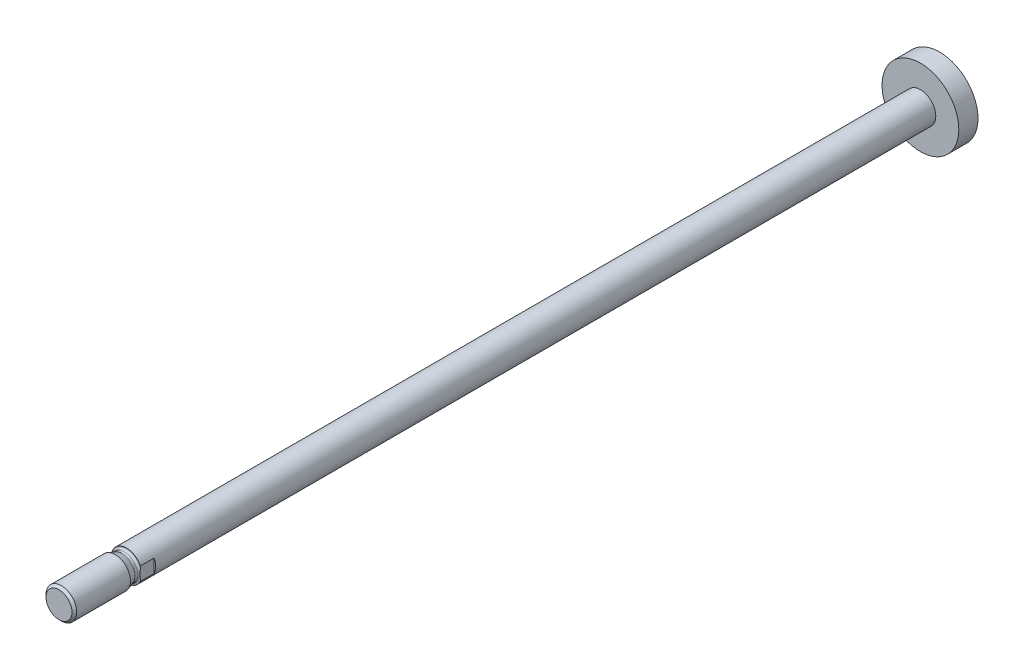
ISO-10303-21;
HEADER;
FILE_DESCRIPTION(('STEP AP214'),'2;1');
FILE_NAME('part.step','',(''),(''),'','','');
FILE_SCHEMA(('AUTOMOTIVE_DESIGN { 1 0 10303 214 1 1 1 1 }'));
ENDSEC;
DATA;
#1=APPLICATION_CONTEXT('core data for automotive mechanical design processes');
#2=APPLICATION_PROTOCOL_DEFINITION('international standard','automotive_design',2000,#1);
#3=PRODUCT_CONTEXT('',#1,'mechanical');
#4=PRODUCT('Part','Part','',(#3));
#5=PRODUCT_RELATED_PRODUCT_CATEGORY('part','',(#4));
#6=PRODUCT_DEFINITION_FORMATION('','',#4);
#7=PRODUCT_DEFINITION_CONTEXT('part definition',#1,'design');
#8=PRODUCT_DEFINITION('design','',#6,#7);
#9=PRODUCT_DEFINITION_SHAPE('','',#8);
#10=(LENGTH_UNIT() NAMED_UNIT(*) SI_UNIT(.MILLI.,.METRE.));
#11=(NAMED_UNIT(*) PLANE_ANGLE_UNIT() SI_UNIT($,.RADIAN.));
#12=(NAMED_UNIT(*) SI_UNIT($,.STERADIAN.) SOLID_ANGLE_UNIT());
#13=UNCERTAINTY_MEASURE_WITH_UNIT(LENGTH_MEASURE(1.E-05),#10,'distance_accuracy_value','');
#14=(GEOMETRIC_REPRESENTATION_CONTEXT(3) GLOBAL_UNCERTAINTY_ASSIGNED_CONTEXT((#13)) GLOBAL_UNIT_ASSIGNED_CONTEXT((#10,
#11,#12)) REPRESENTATION_CONTEXT('',''));
#15=CARTESIAN_POINT('',(0.,0.,0.));
#16=DIRECTION('',(0.,0.,1.));
#17=DIRECTION('',(1.,0.,0.));
#18=AXIS2_PLACEMENT_3D('',#15,#16,#17);
#19=CARTESIAN_POINT('',(0.,0.,28.));
#20=DIRECTION('',(0.,0.,-1.));
#21=DIRECTION('',(-1.,0.,0.));
#22=AXIS2_PLACEMENT_3D('',#19,#20,#21);
#23=PLANE('',#22);
#24=CARTESIAN_POINT('',(0.,0.,28.00000000002));
#25=DIRECTION('',(0.,0.,-1.));
#26=DIRECTION('',(-1.,0.,0.));
#27=AXIS2_PLACEMENT_3D('',#24,#25,#26);
#28=CIRCLE('',#27,4.23299999994242);
#29=CARTESIAN_POINT('',(-4.23299999994242,0.,28.00000000002));
#30=VERTEX_POINT('',#29);
#31=EDGE_CURVE('E19',#30,#30,#28,.T.);
#32=ORIENTED_EDGE('',*,*,#31,.F.);
#33=EDGE_LOOP('',(#32));
#34=FACE_BOUND('',#33,.T.);
#35=ADVANCED_FACE('F16',(#34),#23,.F.);
#36=CARTESIAN_POINT('',(0.,0.,27.2330000000807));
#37=DIRECTION('',(0.,0.,-1.));
#38=DIRECTION('',(-1.,0.,0.));
#39=AXIS2_PLACEMENT_3D('',#36,#37,#38);
#40=CONICAL_SURFACE('',#39,4.99999999988177,0.785398163397448);
#41=ORIENTED_EDGE('',*,*,#31,.T.);
#42=EDGE_LOOP('',(#41));
#43=FACE_BOUND('',#42,.T.);
#44=CARTESIAN_POINT('',(0.,0.,27.233));
#45=DIRECTION('',(0.,0.,1.));
#46=DIRECTION('',(1.,0.,0.));
#47=AXIS2_PLACEMENT_3D('',#44,#45,#46);
#48=CIRCLE('',#47,5.);
#49=CARTESIAN_POINT('',(5.,0.,27.233));
#50=VERTEX_POINT('',#49);
#51=EDGE_CURVE('E254',#50,#50,#48,.F.);
#52=ORIENTED_EDGE('',*,*,#51,.F.);
#53=EDGE_LOOP('',(#52));
#54=FACE_BOUND('',#53,.T.);
#55=ADVANCED_FACE('F241',(#43,#54),#40,.T.);
#56=CARTESIAN_POINT('',(0.,0.,5.));
#57=DIRECTION('',(0.,0.,1.));
#58=DIRECTION('',(1.,0.,0.));
#59=AXIS2_PLACEMENT_3D('',#56,#57,#58);
#60=CYLINDRICAL_SURFACE('',#59,5.);
#61=ORIENTED_EDGE('',*,*,#51,.T.);
#62=EDGE_LOOP('',(#61));
#63=FACE_BOUND('',#62,.T.);
#64=CARTESIAN_POINT('',(0.,0.,9.69798193557381));
#65=DIRECTION('',(0.,0.,1.));
#66=DIRECTION('',(1.,0.,0.));
#67=AXIS2_PLACEMENT_3D('',#64,#65,#66);
#68=CIRCLE('',#67,4.99999999999545);
#69=CARTESIAN_POINT('',(4.99999999999545,0.,9.69798193557381));
#70=VERTEX_POINT('',#69);
#71=EDGE_CURVE('E255',#70,#70,#68,.F.);
#72=ORIENTED_EDGE('',*,*,#71,.F.);
#73=EDGE_LOOP('',(#72));
#74=FACE_BOUND('',#73,.T.);
#75=ADVANCED_FACE('F238',(#63,#74),#60,.T.);
#76=CARTESIAN_POINT('',(0.,0.,9.69798193557381));
#77=DIRECTION('',(0.,0.,1.));
#78=DIRECTION('',(1.,0.,0.));
#79=AXIS2_PLACEMENT_3D('',#76,#77,#78);
#80=CONICAL_SURFACE('',#79,4.99999999999545,0.349065850396762);
#81=ORIENTED_EDGE('',*,*,#71,.T.);
#82=EDGE_LOOP('',(#81));
#83=FACE_BOUND('',#82,.T.);
#84=CARTESIAN_POINT('',(0.,0.,7.59941589757032));
#85=DIRECTION('',(0.,0.,-1.));
#86=DIRECTION('',(-1.,0.,0.));
#87=AXIS2_PLACEMENT_3D('',#84,#85,#86);
#88=CIRCLE('',#87,4.23618442752846);
#89=CARTESIAN_POINT('',(-4.23618442752846,0.,7.59941589757032));
#90=VERTEX_POINT('',#89);
#91=EDGE_CURVE('E221',#90,#90,#88,.F.);
#92=ORIENTED_EDGE('',*,*,#91,.T.);
#93=EDGE_LOOP('',(#92));
#94=FACE_BOUND('',#93,.T.);
#95=ADVANCED_FACE('F233',(#83,#94),#80,.T.);
#96=CARTESIAN_POINT('',(0.,0.,7.39420381157492));
#97=DIRECTION('',(0.,0.,-1.));
#98=DIRECTION('',(-1.,0.,0.));
#99=AXIS2_PLACEMENT_3D('',#96,#97,#98);
#100=TOROIDAL_SURFACE('',#99,4.8,0.599999999999999);
#101=ORIENTED_EDGE('',*,*,#91,.F.);
#102=EDGE_LOOP('',(#101));
#103=FACE_BOUND('',#102,.T.);
#104=CARTESIAN_POINT('',(0.,0.,7.39420381157492));
#105=DIRECTION('',(0.,0.,1.));
#106=DIRECTION('',(1.,0.,0.));
#107=AXIS2_PLACEMENT_3D('',#104,#105,#106);
#108=CIRCLE('',#107,4.2);
#109=CARTESIAN_POINT('',(4.2,0.,7.39420381157492));
#110=VERTEX_POINT('',#109);
#111=EDGE_CURVE('E212',#110,#110,#108,.F.);
#112=ORIENTED_EDGE('',*,*,#111,.F.);
#113=EDGE_LOOP('',(#112));
#114=FACE_BOUND('',#113,.T.);
#115=ADVANCED_FACE('F228',(#103,#114),#100,.F.);
#116=CARTESIAN_POINT('',(0.,12.5,-258.85));
#117=DIRECTION('',(0.,0.,1.));
#118=DIRECTION('',(1.,0.,0.));
#119=AXIS2_PLACEMENT_3D('',#116,#117,#118);
#120=PLANE('',#119);
#121=CARTESIAN_POINT('',(0.,0.,-258.85));
#122=DIRECTION('',(0.,0.,1.));
#123=DIRECTION('',(1.,0.,0.));
#124=AXIS2_PLACEMENT_3D('',#121,#122,#123);
#125=CIRCLE('',#124,12.5);
#126=CARTESIAN_POINT('',(12.5,0.,-258.85));
#127=VERTEX_POINT('',#126);
#128=EDGE_CURVE('E220',#127,#127,#125,.T.);
#129=ORIENTED_EDGE('',*,*,#128,.F.);
#130=EDGE_LOOP('',(#129));
#131=FACE_BOUND('',#130,.T.);
#132=ADVANCED_FACE('F232',(#131),#120,.F.);
#133=CARTESIAN_POINT('',(0.,0.,5.));
#134=DIRECTION('',(0.,0.,1.));
#135=DIRECTION('',(1.,0.,0.));
#136=AXIS2_PLACEMENT_3D('',#133,#134,#135);
#137=CYLINDRICAL_SURFACE('',#136,4.2);
#138=ORIENTED_EDGE('',*,*,#111,.T.);
#139=EDGE_LOOP('',(#138));
#140=FACE_BOUND('',#139,.T.);
#141=CARTESIAN_POINT('',(0.,0.,6.6));
#142=DIRECTION('',(0.,0.,-1.));
#143=DIRECTION('',(-1.,0.,0.));
#144=AXIS2_PLACEMENT_3D('',#141,#142,#143);
#145=CIRCLE('',#144,4.2);
#146=CARTESIAN_POINT('',(-4.2,0.,6.6));
#147=VERTEX_POINT('',#146);
#148=EDGE_CURVE('E276',#147,#147,#145,.F.);
#149=ORIENTED_EDGE('',*,*,#148,.T.);
#150=EDGE_LOOP('',(#149));
#151=FACE_BOUND('',#150,.T.);
#152=ADVANCED_FACE('F271',(#140,#151),#137,.T.);
#153=CARTESIAN_POINT('',(0.,0.,-258.85));
#154=DIRECTION('',(0.,0.,1.));
#155=DIRECTION('',(1.,0.,0.));
#156=AXIS2_PLACEMENT_3D('',#153,#154,#155);
#157=CYLINDRICAL_SURFACE('',#156,12.5);
#158=CARTESIAN_POINT('',(0.,0.,-252.6));
#159=DIRECTION('',(0.,0.,1.));
#160=DIRECTION('',(1.,0.,0.));
#161=AXIS2_PLACEMENT_3D('',#158,#159,#160);
#162=CIRCLE('',#161,12.5);
#163=CARTESIAN_POINT('',(12.5,0.,-252.6));
#164=VERTEX_POINT('',#163);
#165=EDGE_CURVE('E204',#164,#164,#162,.F.);
#166=ORIENTED_EDGE('',*,*,#165,.T.);
#167=EDGE_LOOP('',(#166));
#168=FACE_BOUND('',#167,.T.);
#169=ORIENTED_EDGE('',*,*,#128,.T.);
#170=EDGE_LOOP('',(#169));
#171=FACE_BOUND('',#170,.T.);
#172=ADVANCED_FACE('F174',(#168,#171),#157,.T.);
#173=CARTESIAN_POINT('',(0.,0.,6.6));
#174=DIRECTION('',(0.,0.,-1.));
#175=DIRECTION('',(-1.,0.,0.));
#176=AXIS2_PLACEMENT_3D('',#173,#174,#175);
#177=TOROIDAL_SURFACE('',#176,4.8,0.599999999999998);
#178=ORIENTED_EDGE('',*,*,#148,.F.);
#179=EDGE_LOOP('',(#178));
#180=FACE_BOUND('',#179,.T.);
#181=CARTESIAN_POINT('',(-4.5,-1.670329308849,6.));
#182=CARTESIAN_POINT('',(-4.5,-1.6369330513631,6.00000117040223));
#183=CARTESIAN_POINT('',(-4.5,-1.60353870008505,6.00033761281317));
#184=CARTESIAN_POINT('',(-4.5,-1.53678402517574,6.00158286188886));
#185=CARTESIAN_POINT('',(-4.5,-1.50342369418502,6.00249126346591));
#186=CARTESIAN_POINT('',(-4.5,-1.43672915385537,6.00478221519337));
#187=CARTESIAN_POINT('',(-4.5,-1.403394939861,6.00616463519658));
#188=CARTESIAN_POINT('',(-4.5,-1.33675010316127,6.0093127773252));
#189=CARTESIAN_POINT('',(-4.5,-1.30343947758629,6.0110784396036));
#190=CARTESIAN_POINT('',(-4.5,-1.23682740984282,6.01490639659544));
#191=CARTESIAN_POINT('',(-4.5,-1.20352597189788,6.01696876357747));
#192=CARTESIAN_POINT('',(-4.5,-1.13692453490198,6.02130706454382));
#193=CARTESIAN_POINT('',(-4.5,-1.10362454110037,6.02358307854023));
#194=CARTESIAN_POINT('',(-4.5,-0.970055500660211,6.03297450091988));
#195=CARTESIAN_POINT('',(-4.5,-0.869824880093467,6.04061462109113));
#196=CARTESIAN_POINT('',(-4.5,-0.669294095444825,6.05497755898394));
#197=CARTESIAN_POINT('',(-4.5,-0.568993932116027,6.06170038648787));
#198=CARTESIAN_POINT('',(-4.5,-0.368332410875038,6.07244573968657));
#199=CARTESIAN_POINT('',(-4.5,-0.26797120652601,6.076470876583));
#200=CARTESIAN_POINT('',(-4.5,-0.0672525736976672,6.08072036023677));
#201=CARTESIAN_POINT('',(-4.5,0.0331047738284561,6.08094818941855));
#202=CARTESIAN_POINT('',(-4.5,0.233769564385185,6.07754740137777));
#203=CARTESIAN_POINT('',(-4.5,0.334076991677368,6.07391793974281));
#204=CARTESIAN_POINT('',(-4.5,0.534637397699597,6.06379928349027));
#205=CARTESIAN_POINT('',(-4.5,0.634890214053077,6.05730714852695));
#206=CARTESIAN_POINT('',(-4.5,0.835373518086889,6.04317942656312));
#207=CARTESIAN_POINT('',(-4.5,0.935603947060965,6.03554308551951));
#208=CARTESIAN_POINT('',(-4.5,1.13611388640718,6.02119700715942));
#209=CARTESIAN_POINT('',(-4.5,1.23639337665127,6.01448702408238));
#210=CARTESIAN_POINT('',(-4.5,1.39231556393481,6.00654495544654));
#211=CARTESIAN_POINT('',(-4.5,1.44789697514886,6.00420470218304));
#212=CARTESIAN_POINT('',(-4.5,1.55909116687587,6.00093588356944));
#213=CARTESIAN_POINT('',(-4.5,1.61470394147135,6.00000710765029));
#214=CARTESIAN_POINT('',(-4.5,1.67032930884898,6.));
#215=B_SPLINE_CURVE_WITH_KNOTS('',3,(#181,#182,#183,#184,#185,#186,#187,#188,#189,#190,#191,
#192,#193,#194,#195,#196,#197,#198,#199,#200,#201,#202,#203,#204,#205,#206,#207,#208,#209,#210,
#211,#212,#213,#214),.UNSPECIFIED.,.F.,.F.,(4,2,2,2,2,2,2,2,2,2,2,2,2,2,2,2,4),(0.,
0.100184360814044,0.200297846163573,0.300383866187946,0.400454268039522,0.500549085512339,
0.600681539794873,0.902246113316891,1.20380747058151,1.50507651146084,1.80606925014599,
2.10712789373254,2.4084964874746,2.71006456677907,3.01155248641771,3.17842827063363,
3.34527915730057),.UNSPECIFIED.);
#216=CARTESIAN_POINT('',(-4.5,-1.670329308849,6.));
#217=VERTEX_POINT('',#216);
#218=CARTESIAN_POINT('',(-4.5,1.67032930884898,5.99999999999986));
#219=VERTEX_POINT('',#218);
#220=EDGE_CURVE('E99',#217,#219,#215,.T.);
#221=ORIENTED_EDGE('',*,*,#220,.F.);
#222=CARTESIAN_POINT('',(0.,0.,6.));
#223=DIRECTION('',(0.,0.,1.));
#224=DIRECTION('',(-0.9375,-0.347985272676876,0.));
#225=AXIS2_PLACEMENT_3D('',#222,#223,#224);
#226=CIRCLE('',#225,4.79999999999999);
#227=CARTESIAN_POINT('',(4.5,-1.67032930884898,5.99999999999993));
#228=VERTEX_POINT('',#227);
#229=EDGE_CURVE('E144',#217,#228,#226,.T.);
#230=ORIENTED_EDGE('',*,*,#229,.T.);
#231=CARTESIAN_POINT('',(4.5,1.670329308849,6.));
#232=CARTESIAN_POINT('',(4.5,1.6369330513631,6.00000117040223));
#233=CARTESIAN_POINT('',(4.5,1.60353870008505,6.00033761281317));
#234=CARTESIAN_POINT('',(4.5,1.53678402517574,6.00158286188886));
#235=CARTESIAN_POINT('',(4.5,1.50342369418502,6.00249126346591));
#236=CARTESIAN_POINT('',(4.5,1.43672915385538,6.00478221519337));
#237=CARTESIAN_POINT('',(4.5,1.403394939861,6.00616463519658));
#238=CARTESIAN_POINT('',(4.5,1.33675010316128,6.0093127773252));
#239=CARTESIAN_POINT('',(4.5,1.30343947758629,6.0110784396036));
#240=CARTESIAN_POINT('',(4.5,1.23682740984282,6.01490639659544));
#241=CARTESIAN_POINT('',(4.5,1.20352597189788,6.01696876357747));
#242=CARTESIAN_POINT('',(4.5,1.13692453490198,6.02130706454382));
#243=CARTESIAN_POINT('',(4.5,1.10362454110037,6.02358307854023));
#244=CARTESIAN_POINT('',(4.5,0.970055500660213,6.03297450091988));
#245=CARTESIAN_POINT('',(4.5,0.869824880093468,6.04061462109113));
#246=CARTESIAN_POINT('',(4.5,0.669294095444826,6.05497755898394));
#247=CARTESIAN_POINT('',(4.5,0.568993932116028,6.06170038648787));
#248=CARTESIAN_POINT('',(4.5,0.368332410875039,6.07244573968657));
#249=CARTESIAN_POINT('',(4.5,0.267971206526011,6.076470876583));
#250=CARTESIAN_POINT('',(4.5,0.0672525736976679,6.08072036023677));
#251=CARTESIAN_POINT('',(4.5,-0.0331047738284553,6.08094818941855));
#252=CARTESIAN_POINT('',(4.5,-0.233769564385184,6.07754740137777));
#253=CARTESIAN_POINT('',(4.5,-0.334076991677367,6.07391793974281));
#254=CARTESIAN_POINT('',(4.5,-0.534637397699596,6.06379928349027));
#255=CARTESIAN_POINT('',(4.5,-0.634890214053076,6.05730714852695));
#256=CARTESIAN_POINT('',(4.5,-0.835373518086889,6.04317942656312));
#257=CARTESIAN_POINT('',(4.5,-0.935603947060965,6.03554308551951));
#258=CARTESIAN_POINT('',(4.5,-1.13611388640718,6.02119700715942));
#259=CARTESIAN_POINT('',(4.5,-1.23639337665127,6.01448702408238));
#260=CARTESIAN_POINT('',(4.5,-1.39231556393481,6.00654495544654));
#261=CARTESIAN_POINT('',(4.5,-1.44789697514886,6.00420470218304));
#262=CARTESIAN_POINT('',(4.5,-1.55909116687587,6.00093588356944));
#263=CARTESIAN_POINT('',(4.5,-1.61470394147135,6.00000710765029));
#264=CARTESIAN_POINT('',(4.5,-1.67032930884898,6.));
#265=B_SPLINE_CURVE_WITH_KNOTS('',3,(#231,#232,#233,#234,#235,#236,#237,#238,#239,#240,#241,
#242,#243,#244,#245,#246,#247,#248,#249,#250,#251,#252,#253,#254,#255,#256,#257,#258,#259,#260,
#261,#262,#263,#264),.UNSPECIFIED.,.F.,.F.,(4,2,2,2,2,2,2,2,2,2,2,2,2,2,2,2,4),(0.,
0.100184360814044,0.200297846163573,0.300383866187946,0.400454268039522,0.500549085512339,
0.600681539794873,0.902246113316891,1.20380747058151,1.50507651146084,1.80606925014599,
2.10712789373254,2.4084964874746,2.71006456677907,3.01155248641771,3.17842827063363,
3.34527915730057),.UNSPECIFIED.);
#266=CARTESIAN_POINT('',(4.5,1.670329308849,6.));
#267=VERTEX_POINT('',#266);
#268=EDGE_CURVE('E75',#267,#228,#265,.T.);
#269=ORIENTED_EDGE('',*,*,#268,.F.);
#270=CARTESIAN_POINT('',(0.,0.,6.));
#271=DIRECTION('',(0.,0.,1.));
#272=DIRECTION('',(0.9375,0.347985272676875,0.));
#273=AXIS2_PLACEMENT_3D('',#270,#271,#272);
#274=CIRCLE('',#273,4.79999999999999);
#275=EDGE_CURVE('E70',#267,#219,#274,.T.);
#276=ORIENTED_EDGE('',*,*,#275,.T.);
#277=EDGE_LOOP('',(#221,#230,#269,#276));
#278=FACE_BOUND('',#277,.T.);
#279=ADVANCED_FACE('F111',(#180,#278),#177,.F.);
#280=CARTESIAN_POINT('',(0.,5.,-252.6));
#281=DIRECTION('',(0.,0.,-1.));
#282=DIRECTION('',(-1.,0.,0.));
#283=AXIS2_PLACEMENT_3D('',#280,#281,#282);
#284=PLANE('',#283);
#285=CARTESIAN_POINT('',(0.,0.,-252.6));
#286=DIRECTION('',(0.,0.,1.));
#287=DIRECTION('',(1.,0.,0.));
#288=AXIS2_PLACEMENT_3D('',#285,#286,#287);
#289=CIRCLE('',#288,5.);
#290=CARTESIAN_POINT('',(5.,0.,-252.6));
#291=VERTEX_POINT('',#290);
#292=EDGE_CURVE('E92',#291,#291,#289,.T.);
#293=ORIENTED_EDGE('',*,*,#292,.F.);
#294=EDGE_LOOP('',(#293));
#295=FACE_BOUND('',#294,.T.);
#296=ORIENTED_EDGE('',*,*,#165,.F.);
#297=EDGE_LOOP('',(#296));
#298=FACE_BOUND('',#297,.T.);
#299=ADVANCED_FACE('F167',(#295,#298),#284,.F.);
#300=CARTESIAN_POINT('',(0.,0.,6.));
#301=DIRECTION('',(0.,0.,-1.));
#302=DIRECTION('',(-1.,0.,0.));
#303=AXIS2_PLACEMENT_3D('',#300,#301,#302);
#304=PLANE('',#303);
#305=CARTESIAN_POINT('',(0.,0.,6.00000000000001));
#306=DIRECTION('',(0.,0.,1.));
#307=DIRECTION('',(1.,0.,0.));
#308=AXIS2_PLACEMENT_3D('',#305,#306,#307);
#309=CIRCLE('',#308,5.);
#310=CARTESIAN_POINT('',(-4.5,2.17944947177034,5.99999999999982));
#311=VERTEX_POINT('',#310);
#312=CARTESIAN_POINT('',(4.5,2.17944947177034,6.00000000000001));
#313=VERTEX_POINT('',#312);
#314=EDGE_CURVE('E67',#311,#313,#309,.F.);
#315=ORIENTED_EDGE('',*,*,#314,.F.);
#316=DIRECTION('',(0.,1.,0.));
#317=VECTOR('',#316,1.);
#318=CARTESIAN_POINT('',(-4.5,-9.,5.99999999999964));
#319=LINE('',#318,#317);
#320=EDGE_CURVE('E57',#219,#311,#319,.T.);
#321=ORIENTED_EDGE('',*,*,#320,.F.);
#322=ORIENTED_EDGE('',*,*,#275,.F.);
#323=DIRECTION('',(0.,1.,0.));
#324=VECTOR('',#323,1.);
#325=CARTESIAN_POINT('',(4.5,9.,6.00000000000001));
#326=LINE('',#325,#324);
#327=EDGE_CURVE('E63',#313,#267,#326,.F.);
#328=ORIENTED_EDGE('',*,*,#327,.F.);
#329=EDGE_LOOP('',(#315,#321,#322,#328));
#330=FACE_BOUND('',#329,.T.);
#331=ADVANCED_FACE('F65',(#330),#304,.F.);
#332=CARTESIAN_POINT('',(0.,0.,1.5));
#333=DIRECTION('',(0.,0.,1.));
#334=DIRECTION('',(1.,0.,0.));
#335=AXIS2_PLACEMENT_3D('',#332,#333,#334);
#336=PLANE('',#335);
#337=CARTESIAN_POINT('',(0.,0.,1.5));
#338=DIRECTION('',(0.,0.,1.));
#339=DIRECTION('',(1.,0.,0.));
#340=AXIS2_PLACEMENT_3D('',#337,#338,#339);
#341=CIRCLE('',#340,5.);
#342=CARTESIAN_POINT('',(4.5,2.17944947177034,1.5));
#343=VERTEX_POINT('',#342);
#344=CARTESIAN_POINT('',(4.5,-2.17944947177034,1.5));
#345=VERTEX_POINT('',#344);
#346=EDGE_CURVE('E85',#343,#345,#341,.F.);
#347=ORIENTED_EDGE('',*,*,#346,.F.);
#348=DIRECTION('',(0.,1.,0.));
#349=VECTOR('',#348,1.);
#350=CARTESIAN_POINT('',(4.5,9.,1.5));
#351=LINE('',#350,#349);
#352=EDGE_CURVE('E76',#345,#343,#351,.T.);
#353=ORIENTED_EDGE('',*,*,#352,.F.);
#354=EDGE_LOOP('',(#347,#353));
#355=FACE_BOUND('',#354,.T.);
#356=ADVANCED_FACE('F166',(#355),#336,.T.);
#357=CARTESIAN_POINT('',(4.5,9.,7.));
#358=DIRECTION('',(1.,0.,0.));
#359=DIRECTION('',(0.,0.,-1.));
#360=AXIS2_PLACEMENT_3D('',#357,#358,#359);
#361=PLANE('',#360);
#362=ORIENTED_EDGE('',*,*,#268,.T.);
#363=DIRECTION('',(0.,1.,0.));
#364=VECTOR('',#363,1.);
#365=CARTESIAN_POINT('',(4.5,0.,6.));
#366=LINE('',#365,#364);
#367=CARTESIAN_POINT('',(4.5,-2.17944947177034,6.));
#368=VERTEX_POINT('',#367);
#369=EDGE_CURVE('E137',#228,#368,#366,.F.);
#370=ORIENTED_EDGE('',*,*,#369,.T.);
#371=DIRECTION('',(0.,0.,1.));
#372=VECTOR('',#371,1.);
#373=CARTESIAN_POINT('',(4.5,-2.17944947177034,-258.85));
#374=LINE('',#373,#372);
#375=EDGE_CURVE('E147',#345,#368,#374,.T.);
#376=ORIENTED_EDGE('',*,*,#375,.F.);
#377=ORIENTED_EDGE('',*,*,#352,.T.);
#378=DIRECTION('',(0.,0.,1.));
#379=VECTOR('',#378,1.);
#380=CARTESIAN_POINT('',(4.5,2.17944947177034,-258.85));
#381=LINE('',#380,#379);
#382=EDGE_CURVE('E79',#313,#343,#381,.F.);
#383=ORIENTED_EDGE('',*,*,#382,.F.);
#384=ORIENTED_EDGE('',*,*,#327,.T.);
#385=EDGE_LOOP('',(#362,#370,#376,#377,#383,#384));
#386=FACE_BOUND('',#385,.T.);
#387=ADVANCED_FACE('F80',(#386),#361,.T.);
#388=CARTESIAN_POINT('',(0.,0.,6.));
#389=DIRECTION('',(0.,0.,-1.));
#390=DIRECTION('',(-1.,0.,0.));
#391=AXIS2_PLACEMENT_3D('',#388,#389,#390);
#392=PLANE('',#391);
#393=CARTESIAN_POINT('',(0.,0.,6.00000000000001));
#394=DIRECTION('',(0.,0.,1.));
#395=DIRECTION('',(1.,0.,0.));
#396=AXIS2_PLACEMENT_3D('',#393,#394,#395);
#397=CIRCLE('',#396,5.);
#398=CARTESIAN_POINT('',(-4.5,-2.17944947177034,6.00000000000001));
#399=VERTEX_POINT('',#398);
#400=EDGE_CURVE('E149',#368,#399,#397,.F.);
#401=ORIENTED_EDGE('',*,*,#400,.F.);
#402=ORIENTED_EDGE('',*,*,#369,.F.);
#403=ORIENTED_EDGE('',*,*,#229,.F.);
#404=DIRECTION('',(0.,1.,0.));
#405=VECTOR('',#404,1.);
#406=CARTESIAN_POINT('',(-4.5,-9.,6.00000000000001));
#407=LINE('',#406,#405);
#408=EDGE_CURVE('E101',#399,#217,#407,.T.);
#409=ORIENTED_EDGE('',*,*,#408,.F.);
#410=EDGE_LOOP('',(#401,#402,#403,#409));
#411=FACE_BOUND('',#410,.T.);
#412=ADVANCED_FACE('F122',(#411),#392,.F.);
#413=CARTESIAN_POINT('',(-4.5,-9.,7.));
#414=DIRECTION('',(-1.,0.,0.));
#415=DIRECTION('',(0.,0.,1.));
#416=AXIS2_PLACEMENT_3D('',#413,#414,#415);
#417=PLANE('',#416);
#418=ORIENTED_EDGE('',*,*,#220,.T.);
#419=ORIENTED_EDGE('',*,*,#320,.T.);
#420=DIRECTION('',(0.,0.,1.));
#421=VECTOR('',#420,1.);
#422=CARTESIAN_POINT('',(-4.5,2.17944947177034,-258.85));
#423=LINE('',#422,#421);
#424=CARTESIAN_POINT('',(-4.5,2.17944947177034,1.5));
#425=VERTEX_POINT('',#424);
#426=EDGE_CURVE('E90',#425,#311,#423,.T.);
#427=ORIENTED_EDGE('',*,*,#426,.F.);
#428=DIRECTION('',(0.,1.,0.));
#429=VECTOR('',#428,1.);
#430=CARTESIAN_POINT('',(-4.5,0.,1.5));
#431=LINE('',#430,#429);
#432=CARTESIAN_POINT('',(-4.5,-2.17944947177034,1.5));
#433=VERTEX_POINT('',#432);
#434=EDGE_CURVE('E34',#433,#425,#431,.T.);
#435=ORIENTED_EDGE('',*,*,#434,.F.);
#436=DIRECTION('',(0.,0.,1.));
#437=VECTOR('',#436,1.);
#438=CARTESIAN_POINT('',(-4.5,-2.17944947177034,-258.85));
#439=LINE('',#438,#437);
#440=EDGE_CURVE('E25',#399,#433,#439,.F.);
#441=ORIENTED_EDGE('',*,*,#440,.F.);
#442=ORIENTED_EDGE('',*,*,#408,.T.);
#443=EDGE_LOOP('',(#418,#419,#427,#435,#441,#442));
#444=FACE_BOUND('',#443,.T.);
#445=ADVANCED_FACE('F116',(#444),#417,.T.);
#446=CARTESIAN_POINT('',(0.,0.,1.5));
#447=DIRECTION('',(0.,0.,1.));
#448=DIRECTION('',(1.,0.,0.));
#449=AXIS2_PLACEMENT_3D('',#446,#447,#448);
#450=PLANE('',#449);
#451=CARTESIAN_POINT('',(0.,0.,1.5));
#452=DIRECTION('',(0.,0.,1.));
#453=DIRECTION('',(1.,0.,0.));
#454=AXIS2_PLACEMENT_3D('',#451,#452,#453);
#455=CIRCLE('',#454,5.);
#456=EDGE_CURVE('E11',#433,#425,#455,.F.);
#457=ORIENTED_EDGE('',*,*,#456,.F.);
#458=ORIENTED_EDGE('',*,*,#434,.T.);
#459=EDGE_LOOP('',(#457,#458));
#460=FACE_BOUND('',#459,.T.);
#461=ADVANCED_FACE('F121',(#460),#450,.T.);
#462=CARTESIAN_POINT('',(0.,0.,-258.85));
#463=DIRECTION('',(0.,0.,1.));
#464=DIRECTION('',(1.,0.,0.));
#465=AXIS2_PLACEMENT_3D('',#462,#463,#464);
#466=CYLINDRICAL_SURFACE('',#465,5.);
#467=ORIENTED_EDGE('',*,*,#440,.T.);
#468=ORIENTED_EDGE('',*,*,#456,.T.);
#469=ORIENTED_EDGE('',*,*,#426,.T.);
#470=ORIENTED_EDGE('',*,*,#314,.T.);
#471=ORIENTED_EDGE('',*,*,#382,.T.);
#472=ORIENTED_EDGE('',*,*,#346,.T.);
#473=ORIENTED_EDGE('',*,*,#375,.T.);
#474=ORIENTED_EDGE('',*,*,#400,.T.);
#475=EDGE_LOOP('',(#467,#468,#469,#470,#471,#472,#473,#474));
#476=FACE_BOUND('',#475,.T.);
#477=ORIENTED_EDGE('',*,*,#292,.T.);
#478=EDGE_LOOP('',(#477));
#479=FACE_BOUND('',#478,.T.);
#480=ADVANCED_FACE('F88',(#476,#479),#466,.T.);
#481=CLOSED_SHELL('',(#35,#55,#75,#95,#115,#132,#152,#172,#279,#299,#331,#356,#387,#412,#445,
#461,#480));
#482=MANIFOLD_SOLID_BREP('B1',#481);
#483=ADVANCED_BREP_SHAPE_REPRESENTATION('',(#18,#482),#14);
#484=SHAPE_DEFINITION_REPRESENTATION(#9,#483);
ENDSEC;
END-ISO-10303-21;
